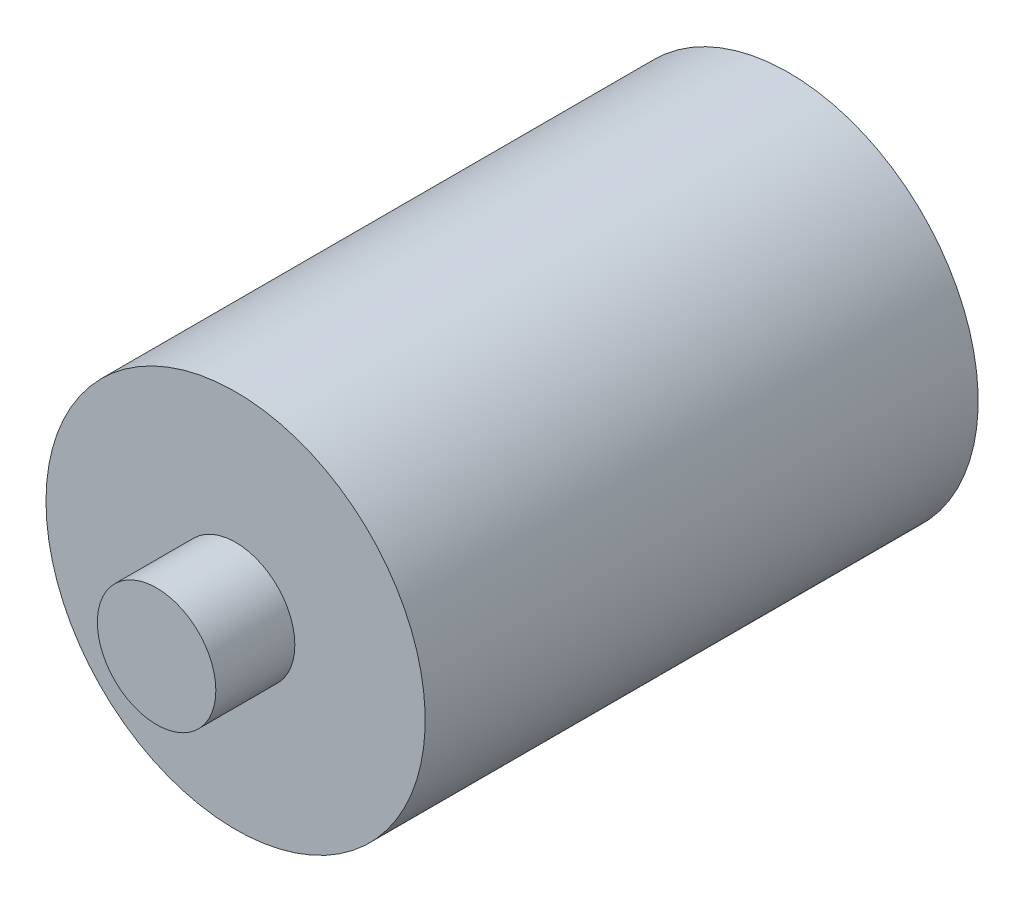
ISO-10303-21;
HEADER;
FILE_DESCRIPTION(('STEP AP214'),'2;1');
FILE_NAME('part.step','',(''),(''),'','','');
FILE_SCHEMA(('AUTOMOTIVE_DESIGN { 1 0 10303 214 1 1 1 1 }'));
ENDSEC;
DATA;
#1=APPLICATION_CONTEXT('core data for automotive mechanical design processes');
#2=APPLICATION_PROTOCOL_DEFINITION('international standard','automotive_design',2000,#1);
#3=PRODUCT_CONTEXT('',#1,'mechanical');
#4=PRODUCT('Part','Part','',(#3));
#5=PRODUCT_RELATED_PRODUCT_CATEGORY('part','',(#4));
#6=PRODUCT_DEFINITION_FORMATION('','',#4);
#7=PRODUCT_DEFINITION_CONTEXT('part definition',#1,'design');
#8=PRODUCT_DEFINITION('design','',#6,#7);
#9=PRODUCT_DEFINITION_SHAPE('','',#8);
#10=(LENGTH_UNIT() NAMED_UNIT(*) SI_UNIT(.MILLI.,.METRE.));
#11=(NAMED_UNIT(*) PLANE_ANGLE_UNIT() SI_UNIT($,.RADIAN.));
#12=(NAMED_UNIT(*) SI_UNIT($,.STERADIAN.) SOLID_ANGLE_UNIT());
#13=UNCERTAINTY_MEASURE_WITH_UNIT(LENGTH_MEASURE(1.E-05),#10,'distance_accuracy_value','');
#14=(GEOMETRIC_REPRESENTATION_CONTEXT(3) GLOBAL_UNCERTAINTY_ASSIGNED_CONTEXT((#13)) GLOBAL_UNIT_ASSIGNED_CONTEXT((#10,
#11,#12)) REPRESENTATION_CONTEXT('',''));
#15=CARTESIAN_POINT('',(0.,0.,0.));
#16=DIRECTION('',(0.,0.,1.));
#17=DIRECTION('',(1.,0.,0.));
#18=AXIS2_PLACEMENT_3D('',#15,#16,#17);
#19=CARTESIAN_POINT('',(0.,0.,20.));
#20=DIRECTION('',(0.,0.,-1.));
#21=DIRECTION('',(-1.,0.,0.));
#22=AXIS2_PLACEMENT_3D('',#19,#20,#21);
#23=CYLINDRICAL_SURFACE('',#22,15.);
#24=CARTESIAN_POINT('',(0.,0.,20.));
#25=DIRECTION('',(0.,0.,1.));
#26=DIRECTION('',(1.,0.,0.));
#27=AXIS2_PLACEMENT_3D('',#24,#25,#26);
#28=CIRCLE('',#27,15.);
#29=CARTESIAN_POINT('',(15.,0.,20.));
#30=VERTEX_POINT('',#29);
#31=EDGE_CURVE('E47',#30,#30,#28,.T.);
#32=ORIENTED_EDGE('',*,*,#31,.F.);
#33=EDGE_LOOP('',(#32));
#34=FACE_BOUND('',#33,.T.);
#35=CARTESIAN_POINT('',(0.,0.,0.));
#36=DIRECTION('',(0.,0.,1.));
#37=DIRECTION('',(1.,0.,0.));
#38=AXIS2_PLACEMENT_3D('',#35,#36,#37);
#39=CIRCLE('',#38,15.);
#40=CARTESIAN_POINT('',(15.,0.,0.));
#41=VERTEX_POINT('',#40);
#42=EDGE_CURVE('E43',#41,#41,#39,.T.);
#43=ORIENTED_EDGE('',*,*,#42,.T.);
#44=EDGE_LOOP('',(#43));
#45=FACE_BOUND('',#44,.T.);
#46=ADVANCED_FACE('F40',(#34,#45),#23,.T.);
#47=CARTESIAN_POINT('',(0.,0.,20.));
#48=DIRECTION('',(0.,0.,1.));
#49=DIRECTION('',(1.,0.,0.));
#50=AXIS2_PLACEMENT_3D('',#47,#48,#49);
#51=PLANE('',#50);
#52=ORIENTED_EDGE('',*,*,#31,.T.);
#53=EDGE_LOOP('',(#52));
#54=FACE_BOUND('',#53,.T.);
#55=ADVANCED_FACE('F81',(#54),#51,.T.);
#56=CARTESIAN_POINT('',(0.,0.,-140.));
#57=DIRECTION('',(0.,0.,1.));
#58=DIRECTION('',(1.,0.,0.));
#59=AXIS2_PLACEMENT_3D('',#56,#57,#58);
#60=CYLINDRICAL_SURFACE('',#59,48.);
#61=CARTESIAN_POINT('',(0.,0.,-140.));
#62=DIRECTION('',(0.,0.,-1.));
#63=DIRECTION('',(-1.,0.,0.));
#64=AXIS2_PLACEMENT_3D('',#61,#62,#63);
#65=CIRCLE('',#64,48.);
#66=CARTESIAN_POINT('',(-48.,0.,-140.));
#67=VERTEX_POINT('',#66);
#68=EDGE_CURVE('E55',#67,#67,#65,.T.);
#69=ORIENTED_EDGE('',*,*,#68,.F.);
#70=EDGE_LOOP('',(#69));
#71=FACE_BOUND('',#70,.T.);
#72=CARTESIAN_POINT('',(0.,0.,0.));
#73=DIRECTION('',(0.,0.,-1.));
#74=DIRECTION('',(-1.,0.,0.));
#75=AXIS2_PLACEMENT_3D('',#72,#73,#74);
#76=CIRCLE('',#75,48.);
#77=CARTESIAN_POINT('',(-48.,0.,0.));
#78=VERTEX_POINT('',#77);
#79=EDGE_CURVE('E58',#78,#78,#76,.T.);
#80=ORIENTED_EDGE('',*,*,#79,.T.);
#81=EDGE_LOOP('',(#80));
#82=FACE_BOUND('',#81,.T.);
#83=ADVANCED_FACE('F86',(#71,#82),#60,.T.);
#84=CARTESIAN_POINT('',(0.,0.,-140.));
#85=DIRECTION('',(0.,0.,-1.));
#86=DIRECTION('',(-1.,0.,0.));
#87=AXIS2_PLACEMENT_3D('',#84,#85,#86);
#88=PLANE('',#87);
#89=CARTESIAN_POINT('',(0.,0.,-140.));
#90=DIRECTION('',(0.,0.,-1.));
#91=DIRECTION('',(-1.,0.,0.));
#92=AXIS2_PLACEMENT_3D('',#89,#90,#91);
#93=CIRCLE('',#92,15.);
#94=CARTESIAN_POINT('',(-15.,0.,-140.));
#95=VERTEX_POINT('',#94);
#96=EDGE_CURVE('E10',#95,#95,#93,.T.);
#97=ORIENTED_EDGE('',*,*,#96,.F.);
#98=EDGE_LOOP('',(#97));
#99=FACE_BOUND('',#98,.T.);
#100=ORIENTED_EDGE('',*,*,#68,.T.);
#101=EDGE_LOOP('',(#100));
#102=FACE_BOUND('',#101,.T.);
#103=ADVANCED_FACE('F76',(#99,#102),#88,.T.);
#104=CARTESIAN_POINT('',(0.,0.,0.));
#105=DIRECTION('',(0.,0.,-1.));
#106=DIRECTION('',(-1.,0.,0.));
#107=AXIS2_PLACEMENT_3D('',#104,#105,#106);
#108=PLANE('',#107);
#109=ORIENTED_EDGE('',*,*,#42,.F.);
#110=EDGE_LOOP('',(#109));
#111=FACE_BOUND('',#110,.T.);
#112=ORIENTED_EDGE('',*,*,#79,.F.);
#113=EDGE_LOOP('',(#112));
#114=FACE_BOUND('',#113,.T.);
#115=ADVANCED_FACE('F69',(#111,#114),#108,.F.);
#116=CARTESIAN_POINT('',(0.,0.,-160.));
#117=DIRECTION('',(0.,0.,1.));
#118=DIRECTION('',(1.,0.,0.));
#119=AXIS2_PLACEMENT_3D('',#116,#117,#118);
#120=CYLINDRICAL_SURFACE('',#119,15.);
#121=CARTESIAN_POINT('',(0.,0.,-160.));
#122=DIRECTION('',(0.,0.,-1.));
#123=DIRECTION('',(-1.,0.,0.));
#124=AXIS2_PLACEMENT_3D('',#121,#122,#123);
#125=CIRCLE('',#124,15.);
#126=CARTESIAN_POINT('',(-15.,0.,-160.));
#127=VERTEX_POINT('',#126);
#128=EDGE_CURVE('E54',#127,#127,#125,.T.);
#129=ORIENTED_EDGE('',*,*,#128,.F.);
#130=EDGE_LOOP('',(#129));
#131=FACE_BOUND('',#130,.T.);
#132=ORIENTED_EDGE('',*,*,#96,.T.);
#133=EDGE_LOOP('',(#132));
#134=FACE_BOUND('',#133,.T.);
#135=ADVANCED_FACE('F67',(#131,#134),#120,.T.);
#136=CARTESIAN_POINT('',(0.,0.,-160.));
#137=DIRECTION('',(0.,0.,-1.));
#138=DIRECTION('',(-1.,0.,0.));
#139=AXIS2_PLACEMENT_3D('',#136,#137,#138);
#140=PLANE('',#139);
#141=ORIENTED_EDGE('',*,*,#128,.T.);
#142=EDGE_LOOP('',(#141));
#143=FACE_BOUND('',#142,.T.);
#144=ADVANCED_FACE('F65',(#143),#140,.T.);
#145=CLOSED_SHELL('',(#46,#55,#83,#103,#115,#135,#144));
#146=MANIFOLD_SOLID_BREP('B2',#145);
#147=ADVANCED_BREP_SHAPE_REPRESENTATION('',(#18,#146),#14);
#148=SHAPE_DEFINITION_REPRESENTATION(#9,#147);
ENDSEC;
END-ISO-10303-21;
